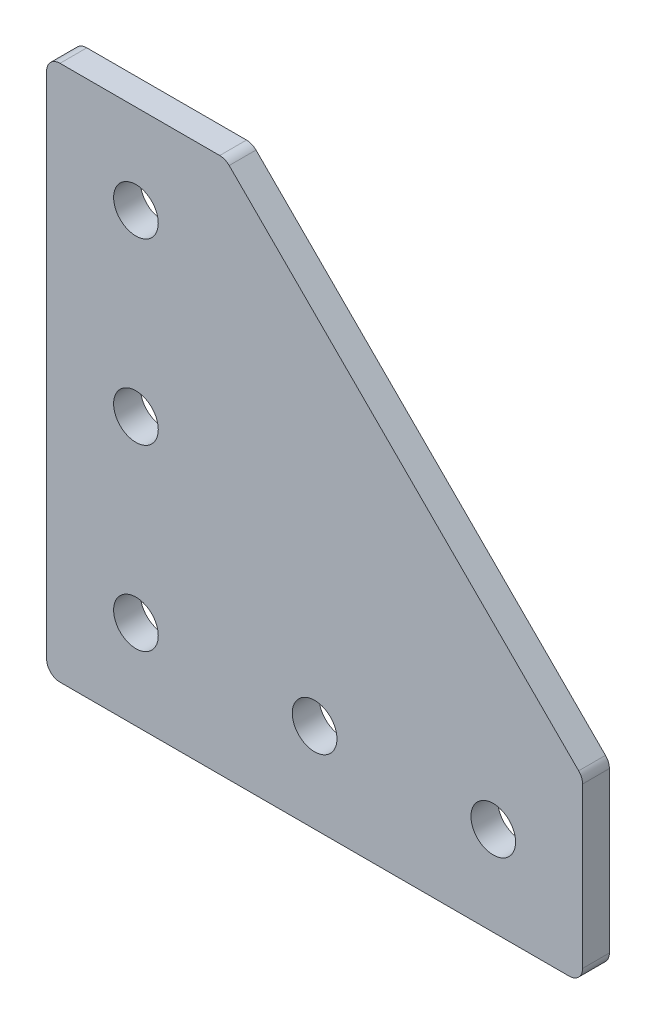
ISO-10303-21;
HEADER;
FILE_DESCRIPTION(('STEP AP214'),'2;1');
FILE_NAME('part.step','',(''),(''),'','','');
FILE_SCHEMA(('AUTOMOTIVE_DESIGN { 1 0 10303 214 1 1 1 1 }'));
ENDSEC;
DATA;
#1=APPLICATION_CONTEXT('core data for automotive mechanical design processes');
#2=APPLICATION_PROTOCOL_DEFINITION('international standard','automotive_design',2000,#1);
#3=PRODUCT_CONTEXT('',#1,'mechanical');
#4=PRODUCT('Part','Part','',(#3));
#5=PRODUCT_RELATED_PRODUCT_CATEGORY('part','',(#4));
#6=PRODUCT_DEFINITION_FORMATION('','',#4);
#7=PRODUCT_DEFINITION_CONTEXT('part definition',#1,'design');
#8=PRODUCT_DEFINITION('design','',#6,#7);
#9=PRODUCT_DEFINITION_SHAPE('','',#8);
#10=(LENGTH_UNIT() NAMED_UNIT(*) SI_UNIT(.MILLI.,.METRE.));
#11=(NAMED_UNIT(*) PLANE_ANGLE_UNIT() SI_UNIT($,.RADIAN.));
#12=(NAMED_UNIT(*) SI_UNIT($,.STERADIAN.) SOLID_ANGLE_UNIT());
#13=UNCERTAINTY_MEASURE_WITH_UNIT(LENGTH_MEASURE(1.E-05),#10,'distance_accuracy_value','');
#14=(GEOMETRIC_REPRESENTATION_CONTEXT(3) GLOBAL_UNCERTAINTY_ASSIGNED_CONTEXT((#13)) GLOBAL_UNIT_ASSIGNED_CONTEXT((#10,
#11,#12)) REPRESENTATION_CONTEXT('',''));
#15=CARTESIAN_POINT('',(0.,0.,0.));
#16=DIRECTION('',(0.,0.,1.));
#17=DIRECTION('',(1.,0.,0.));
#18=AXIS2_PLACEMENT_3D('',#15,#16,#17);
#19=CARTESIAN_POINT('',(58.5,19.3786796564404,-3.));
#20=DIRECTION('',(0.,0.,1.));
#21=DIRECTION('',(1.,0.,0.));
#22=AXIS2_PLACEMENT_3D('',#19,#20,#21);
#23=CYLINDRICAL_SURFACE('',#22,1.5);
#24=CARTESIAN_POINT('',(58.5,19.3786796564404,0.));
#25=DIRECTION('',(0.,0.,1.));
#26=DIRECTION('',(1.,0.,0.));
#27=AXIS2_PLACEMENT_3D('',#24,#25,#26);
#28=CIRCLE('',#27,1.5);
#29=CARTESIAN_POINT('',(60.,19.3786796564404,0.));
#30=VERTEX_POINT('',#29);
#31=CARTESIAN_POINT('',(59.5606601717798,20.4393398282202,0.));
#32=VERTEX_POINT('',#31);
#33=EDGE_CURVE('E144',#30,#32,#28,.T.);
#34=ORIENTED_EDGE('',*,*,#33,.F.);
#35=DIRECTION('',(0.,0.,1.));
#36=VECTOR('',#35,1.);
#37=CARTESIAN_POINT('',(60.,19.3786796564404,-3.));
#38=LINE('',#37,#36);
#39=CARTESIAN_POINT('',(60.,19.3786796564404,-3.));
#40=VERTEX_POINT('',#39);
#41=EDGE_CURVE('E11',#40,#30,#38,.T.);
#42=ORIENTED_EDGE('',*,*,#41,.F.);
#43=CARTESIAN_POINT('',(58.5,19.3786796564404,-3.));
#44=DIRECTION('',(0.,0.,1.));
#45=DIRECTION('',(1.,0.,0.));
#46=AXIS2_PLACEMENT_3D('',#43,#44,#45);
#47=CIRCLE('',#46,1.5);
#48=CARTESIAN_POINT('',(59.5606601717798,20.4393398282202,-3.));
#49=VERTEX_POINT('',#48);
#50=EDGE_CURVE('E171',#40,#49,#47,.T.);
#51=ORIENTED_EDGE('',*,*,#50,.T.);
#52=DIRECTION('',(0.,0.,1.));
#53=VECTOR('',#52,1.);
#54=CARTESIAN_POINT('',(59.5606601717798,20.4393398282202,-3.));
#55=LINE('',#54,#53);
#56=EDGE_CURVE('E38',#49,#32,#55,.T.);
#57=ORIENTED_EDGE('',*,*,#56,.T.);
#58=EDGE_LOOP('',(#34,#42,#51,#57));
#59=FACE_BOUND('',#58,.T.);
#60=ADVANCED_FACE('F35',(#59),#23,.T.);
#61=CARTESIAN_POINT('',(60.,19.3786796564404,-3.));
#62=DIRECTION('',(1.,0.,0.));
#63=DIRECTION('',(0.,0.,-1.));
#64=AXIS2_PLACEMENT_3D('',#61,#62,#63);
#65=PLANE('',#64);
#66=DIRECTION('',(0.,1.,0.));
#67=VECTOR('',#66,1.);
#68=CARTESIAN_POINT('',(60.,19.3786796564404,0.));
#69=LINE('',#68,#67);
#70=CARTESIAN_POINT('',(60.,1.50000000000001,0.));
#71=VERTEX_POINT('',#70);
#72=EDGE_CURVE('E169',#71,#30,#69,.T.);
#73=ORIENTED_EDGE('',*,*,#72,.F.);
#74=DIRECTION('',(0.,0.,1.));
#75=VECTOR('',#74,1.);
#76=CARTESIAN_POINT('',(60.,1.50000000000001,-3.));
#77=LINE('',#76,#75);
#78=CARTESIAN_POINT('',(60.,1.50000000000001,-3.));
#79=VERTEX_POINT('',#78);
#80=EDGE_CURVE('E44',#79,#71,#77,.T.);
#81=ORIENTED_EDGE('',*,*,#80,.F.);
#82=DIRECTION('',(0.,1.,0.));
#83=VECTOR('',#82,1.);
#84=CARTESIAN_POINT('',(60.,19.3786796564404,-3.));
#85=LINE('',#84,#83);
#86=EDGE_CURVE('E134',#79,#40,#85,.T.);
#87=ORIENTED_EDGE('',*,*,#86,.T.);
#88=ORIENTED_EDGE('',*,*,#41,.T.);
#89=EDGE_LOOP('',(#73,#81,#87,#88));
#90=FACE_BOUND('',#89,.T.);
#91=ADVANCED_FACE('F187',(#90),#65,.T.);
#92=CARTESIAN_POINT('',(58.5,1.5,-3.));
#93=DIRECTION('',(0.,0.,1.));
#94=DIRECTION('',(1.,0.,0.));
#95=AXIS2_PLACEMENT_3D('',#92,#93,#94);
#96=CYLINDRICAL_SURFACE('',#95,1.5);
#97=CARTESIAN_POINT('',(58.5,1.5,0.));
#98=DIRECTION('',(0.,0.,1.));
#99=DIRECTION('',(1.,0.,0.));
#100=AXIS2_PLACEMENT_3D('',#97,#98,#99);
#101=CIRCLE('',#100,1.5);
#102=CARTESIAN_POINT('',(58.5,0.,0.));
#103=VERTEX_POINT('',#102);
#104=EDGE_CURVE('E121',#103,#71,#101,.T.);
#105=ORIENTED_EDGE('',*,*,#104,.F.);
#106=DIRECTION('',(0.,0.,1.));
#107=VECTOR('',#106,1.);
#108=CARTESIAN_POINT('',(58.5,0.,-3.));
#109=LINE('',#108,#107);
#110=CARTESIAN_POINT('',(58.5,0.,-3.));
#111=VERTEX_POINT('',#110);
#112=EDGE_CURVE('E116',#111,#103,#109,.T.);
#113=ORIENTED_EDGE('',*,*,#112,.F.);
#114=CARTESIAN_POINT('',(58.5,1.5,-3.));
#115=DIRECTION('',(0.,0.,1.));
#116=DIRECTION('',(1.,0.,0.));
#117=AXIS2_PLACEMENT_3D('',#114,#115,#116);
#118=CIRCLE('',#117,1.5);
#119=EDGE_CURVE('E119',#111,#79,#118,.T.);
#120=ORIENTED_EDGE('',*,*,#119,.T.);
#121=ORIENTED_EDGE('',*,*,#80,.T.);
#122=EDGE_LOOP('',(#105,#113,#120,#121));
#123=FACE_BOUND('',#122,.T.);
#124=ADVANCED_FACE('F118',(#123),#96,.T.);
#125=CARTESIAN_POINT('',(1.50000000000001,0.,-3.));
#126=DIRECTION('',(0.,-1.,0.));
#127=DIRECTION('',(0.,0.,-1.));
#128=AXIS2_PLACEMENT_3D('',#125,#126,#127);
#129=PLANE('',#128);
#130=DIRECTION('',(1.,0.,0.));
#131=VECTOR('',#130,1.);
#132=CARTESIAN_POINT('',(1.50000000000001,0.,0.));
#133=LINE('',#132,#131);
#134=CARTESIAN_POINT('',(1.50000000000001,0.,0.));
#135=VERTEX_POINT('',#134);
#136=EDGE_CURVE('E166',#135,#103,#133,.T.);
#137=ORIENTED_EDGE('',*,*,#136,.F.);
#138=DIRECTION('',(0.,0.,1.));
#139=VECTOR('',#138,1.);
#140=CARTESIAN_POINT('',(1.50000000000001,0.,-3.));
#141=LINE('',#140,#139);
#142=CARTESIAN_POINT('',(1.50000000000001,0.,-3.));
#143=VERTEX_POINT('',#142);
#144=EDGE_CURVE('E126',#143,#135,#141,.T.);
#145=ORIENTED_EDGE('',*,*,#144,.F.);
#146=DIRECTION('',(1.,0.,0.));
#147=VECTOR('',#146,1.);
#148=CARTESIAN_POINT('',(1.50000000000001,0.,-3.));
#149=LINE('',#148,#147);
#150=EDGE_CURVE('E132',#143,#111,#149,.T.);
#151=ORIENTED_EDGE('',*,*,#150,.T.);
#152=ORIENTED_EDGE('',*,*,#112,.T.);
#153=EDGE_LOOP('',(#137,#145,#151,#152));
#154=FACE_BOUND('',#153,.T.);
#155=ADVANCED_FACE('F136',(#154),#129,.T.);
#156=CARTESIAN_POINT('',(1.5,1.5,-3.));
#157=DIRECTION('',(0.,0.,1.));
#158=DIRECTION('',(1.,0.,0.));
#159=AXIS2_PLACEMENT_3D('',#156,#157,#158);
#160=CYLINDRICAL_SURFACE('',#159,1.5);
#161=CARTESIAN_POINT('',(1.5,1.5,0.));
#162=DIRECTION('',(0.,0.,1.));
#163=DIRECTION('',(1.,0.,0.));
#164=AXIS2_PLACEMENT_3D('',#161,#162,#163);
#165=CIRCLE('',#164,1.5);
#166=CARTESIAN_POINT('',(0.,1.50000000000001,0.));
#167=VERTEX_POINT('',#166);
#168=EDGE_CURVE('E163',#167,#135,#165,.T.);
#169=ORIENTED_EDGE('',*,*,#168,.F.);
#170=DIRECTION('',(0.,0.,1.));
#171=VECTOR('',#170,1.);
#172=CARTESIAN_POINT('',(0.,1.50000000000001,-3.));
#173=LINE('',#172,#171);
#174=CARTESIAN_POINT('',(0.,1.50000000000001,-3.));
#175=VERTEX_POINT('',#174);
#176=EDGE_CURVE('E175',#175,#167,#173,.T.);
#177=ORIENTED_EDGE('',*,*,#176,.F.);
#178=CARTESIAN_POINT('',(1.5,1.5,-3.));
#179=DIRECTION('',(0.,0.,1.));
#180=DIRECTION('',(1.,0.,0.));
#181=AXIS2_PLACEMENT_3D('',#178,#179,#180);
#182=CIRCLE('',#181,1.5);
#183=EDGE_CURVE('E137',#175,#143,#182,.T.);
#184=ORIENTED_EDGE('',*,*,#183,.T.);
#185=ORIENTED_EDGE('',*,*,#144,.T.);
#186=EDGE_LOOP('',(#169,#177,#184,#185));
#187=FACE_BOUND('',#186,.T.);
#188=ADVANCED_FACE('F200',(#187),#160,.T.);
#189=CARTESIAN_POINT('',(0.,1.50000000000001,-3.));
#190=DIRECTION('',(-1.,0.,0.));
#191=DIRECTION('',(0.,0.,1.));
#192=AXIS2_PLACEMENT_3D('',#189,#190,#191);
#193=PLANE('',#192);
#194=DIRECTION('',(0.,-1.,0.));
#195=VECTOR('',#194,1.);
#196=CARTESIAN_POINT('',(0.,1.50000000000001,0.));
#197=LINE('',#196,#195);
#198=CARTESIAN_POINT('',(0.,58.5,0.));
#199=VERTEX_POINT('',#198);
#200=EDGE_CURVE('E160',#199,#167,#197,.T.);
#201=ORIENTED_EDGE('',*,*,#200,.F.);
#202=DIRECTION('',(0.,0.,1.));
#203=VECTOR('',#202,1.);
#204=CARTESIAN_POINT('',(0.,58.5,-3.));
#205=LINE('',#204,#203);
#206=CARTESIAN_POINT('',(0.,58.5,-3.));
#207=VERTEX_POINT('',#206);
#208=EDGE_CURVE('E177',#207,#199,#205,.T.);
#209=ORIENTED_EDGE('',*,*,#208,.F.);
#210=DIRECTION('',(0.,-1.,0.));
#211=VECTOR('',#210,1.);
#212=CARTESIAN_POINT('',(0.,1.50000000000001,-3.));
#213=LINE('',#212,#211);
#214=EDGE_CURVE('E139',#207,#175,#213,.T.);
#215=ORIENTED_EDGE('',*,*,#214,.T.);
#216=ORIENTED_EDGE('',*,*,#176,.T.);
#217=EDGE_LOOP('',(#201,#209,#215,#216));
#218=FACE_BOUND('',#217,.T.);
#219=ADVANCED_FACE('F203',(#218),#193,.T.);
#220=CARTESIAN_POINT('',(1.5,58.5,-3.));
#221=DIRECTION('',(0.,0.,1.));
#222=DIRECTION('',(1.,0.,0.));
#223=AXIS2_PLACEMENT_3D('',#220,#221,#222);
#224=CYLINDRICAL_SURFACE('',#223,1.5);
#225=CARTESIAN_POINT('',(1.5,58.5,0.));
#226=DIRECTION('',(0.,0.,1.));
#227=DIRECTION('',(1.,0.,0.));
#228=AXIS2_PLACEMENT_3D('',#225,#226,#227);
#229=CIRCLE('',#228,1.5);
#230=CARTESIAN_POINT('',(1.50000000000001,60.,0.));
#231=VERTEX_POINT('',#230);
#232=EDGE_CURVE('E157',#231,#199,#229,.T.);
#233=ORIENTED_EDGE('',*,*,#232,.F.);
#234=DIRECTION('',(0.,0.,1.));
#235=VECTOR('',#234,1.);
#236=CARTESIAN_POINT('',(1.50000000000001,60.,-3.));
#237=LINE('',#236,#235);
#238=CARTESIAN_POINT('',(1.50000000000001,60.,-3.));
#239=VERTEX_POINT('',#238);
#240=EDGE_CURVE('E179',#239,#231,#237,.T.);
#241=ORIENTED_EDGE('',*,*,#240,.F.);
#242=CARTESIAN_POINT('',(1.5,58.5,-3.));
#243=DIRECTION('',(0.,0.,1.));
#244=DIRECTION('',(1.,0.,0.));
#245=AXIS2_PLACEMENT_3D('',#242,#243,#244);
#246=CIRCLE('',#245,1.5);
#247=EDGE_CURVE('E293',#239,#207,#246,.T.);
#248=ORIENTED_EDGE('',*,*,#247,.T.);
#249=ORIENTED_EDGE('',*,*,#208,.T.);
#250=EDGE_LOOP('',(#233,#241,#248,#249));
#251=FACE_BOUND('',#250,.T.);
#252=ADVANCED_FACE('F207',(#251),#224,.T.);
#253=CARTESIAN_POINT('',(1.50000000000001,60.,-3.));
#254=DIRECTION('',(0.,1.,0.));
#255=DIRECTION('',(0.,0.,1.));
#256=AXIS2_PLACEMENT_3D('',#253,#254,#255);
#257=PLANE('',#256);
#258=DIRECTION('',(-1.,0.,0.));
#259=VECTOR('',#258,1.);
#260=CARTESIAN_POINT('',(1.50000000000001,60.,0.));
#261=LINE('',#260,#259);
#262=CARTESIAN_POINT('',(19.3786796564404,60.,0.));
#263=VERTEX_POINT('',#262);
#264=EDGE_CURVE('E154',#263,#231,#261,.T.);
#265=ORIENTED_EDGE('',*,*,#264,.F.);
#266=DIRECTION('',(0.,0.,1.));
#267=VECTOR('',#266,1.);
#268=CARTESIAN_POINT('',(19.3786796564404,60.,-3.));
#269=LINE('',#268,#267);
#270=CARTESIAN_POINT('',(19.3786796564404,60.,-3.));
#271=VERTEX_POINT('',#270);
#272=EDGE_CURVE('E181',#271,#263,#269,.T.);
#273=ORIENTED_EDGE('',*,*,#272,.F.);
#274=DIRECTION('',(-1.,0.,0.));
#275=VECTOR('',#274,1.);
#276=CARTESIAN_POINT('',(1.50000000000001,60.,-3.));
#277=LINE('',#276,#275);
#278=EDGE_CURVE('E290',#271,#239,#277,.T.);
#279=ORIENTED_EDGE('',*,*,#278,.T.);
#280=ORIENTED_EDGE('',*,*,#240,.T.);
#281=EDGE_LOOP('',(#265,#273,#279,#280));
#282=FACE_BOUND('',#281,.T.);
#283=ADVANCED_FACE('F211',(#282),#257,.T.);
#284=CARTESIAN_POINT('',(19.3786796564404,58.5,-3.));
#285=DIRECTION('',(0.,0.,1.));
#286=DIRECTION('',(1.,0.,0.));
#287=AXIS2_PLACEMENT_3D('',#284,#285,#286);
#288=CYLINDRICAL_SURFACE('',#287,1.5);
#289=CARTESIAN_POINT('',(19.3786796564404,58.5,0.));
#290=DIRECTION('',(0.,0.,1.));
#291=DIRECTION('',(-1.,0.,0.));
#292=AXIS2_PLACEMENT_3D('',#289,#290,#291);
#293=CIRCLE('',#292,1.5);
#294=CARTESIAN_POINT('',(20.4393398282202,59.5606601717798,0.));
#295=VERTEX_POINT('',#294);
#296=EDGE_CURVE('E151',#295,#263,#293,.T.);
#297=ORIENTED_EDGE('',*,*,#296,.F.);
#298=DIRECTION('',(0.,0.,1.));
#299=VECTOR('',#298,1.);
#300=CARTESIAN_POINT('',(20.4393398282202,59.5606601717798,-3.));
#301=LINE('',#300,#299);
#302=CARTESIAN_POINT('',(20.4393398282202,59.5606601717798,-3.));
#303=VERTEX_POINT('',#302);
#304=EDGE_CURVE('E182',#303,#295,#301,.T.);
#305=ORIENTED_EDGE('',*,*,#304,.F.);
#306=CARTESIAN_POINT('',(19.3786796564404,58.5,-3.));
#307=DIRECTION('',(0.,0.,1.));
#308=DIRECTION('',(-1.,0.,0.));
#309=AXIS2_PLACEMENT_3D('',#306,#307,#308);
#310=CIRCLE('',#309,1.5);
#311=EDGE_CURVE('E287',#303,#271,#310,.T.);
#312=ORIENTED_EDGE('',*,*,#311,.T.);
#313=ORIENTED_EDGE('',*,*,#272,.T.);
#314=EDGE_LOOP('',(#297,#305,#312,#313));
#315=FACE_BOUND('',#314,.T.);
#316=ADVANCED_FACE('F215',(#315),#288,.T.);
#317=CARTESIAN_POINT('',(20.4393398282202,59.5606601717798,-3.));
#318=DIRECTION('',(0.707106781186547,0.707106781186547,0.));
#319=DIRECTION('',(-0.707106781186548,0.707106781186548,0.));
#320=AXIS2_PLACEMENT_3D('',#317,#318,#319);
#321=PLANE('',#320);
#322=DIRECTION('',(-0.707106781186548,0.707106781186548,0.));
#323=VECTOR('',#322,1.);
#324=CARTESIAN_POINT('',(20.4393398282202,59.5606601717798,0.));
#325=LINE('',#324,#323);
#326=EDGE_CURVE('E147',#32,#295,#325,.T.);
#327=ORIENTED_EDGE('',*,*,#326,.F.);
#328=ORIENTED_EDGE('',*,*,#56,.F.);
#329=DIRECTION('',(-0.707106781186548,0.707106781186548,0.));
#330=VECTOR('',#329,1.);
#331=CARTESIAN_POINT('',(20.4393398282202,59.5606601717798,-3.));
#332=LINE('',#331,#330);
#333=EDGE_CURVE('E285',#49,#303,#332,.T.);
#334=ORIENTED_EDGE('',*,*,#333,.T.);
#335=ORIENTED_EDGE('',*,*,#304,.T.);
#336=EDGE_LOOP('',(#327,#328,#334,#335));
#337=FACE_BOUND('',#336,.T.);
#338=ADVANCED_FACE('F184',(#337),#321,.T.);
#339=CARTESIAN_POINT('',(58.5,19.3786796564404,-3.));
#340=DIRECTION('',(0.,0.,1.));
#341=DIRECTION('',(1.,0.,0.));
#342=AXIS2_PLACEMENT_3D('',#339,#340,#341);
#343=PLANE('',#342);
#344=CARTESIAN_POINT('',(9.99999999999986,50.,-3.));
#345=DIRECTION('',(0.,0.,1.));
#346=DIRECTION('',(1.,0.,0.));
#347=AXIS2_PLACEMENT_3D('',#344,#345,#346);
#348=CIRCLE('',#347,2.5);
#349=CARTESIAN_POINT('',(12.4999999999999,50.,-3.));
#350=VERTEX_POINT('',#349);
#351=EDGE_CURVE('E254',#350,#350,#348,.T.);
#352=ORIENTED_EDGE('',*,*,#351,.T.);
#353=EDGE_LOOP('',(#352));
#354=FACE_BOUND('',#353,.T.);
#355=CARTESIAN_POINT('',(10.,30.,-3.));
#356=DIRECTION('',(0.,0.,1.));
#357=DIRECTION('',(1.,0.,0.));
#358=AXIS2_PLACEMENT_3D('',#355,#356,#357);
#359=CIRCLE('',#358,2.49999999999992);
#360=CARTESIAN_POINT('',(12.4999999999999,30.,-3.));
#361=VERTEX_POINT('',#360);
#362=EDGE_CURVE('E262',#361,#361,#359,.T.);
#363=ORIENTED_EDGE('',*,*,#362,.T.);
#364=EDGE_LOOP('',(#363));
#365=FACE_BOUND('',#364,.T.);
#366=CARTESIAN_POINT('',(50.,10.,-3.));
#367=DIRECTION('',(0.,0.,1.));
#368=DIRECTION('',(1.,0.,0.));
#369=AXIS2_PLACEMENT_3D('',#366,#367,#368);
#370=CIRCLE('',#369,2.5);
#371=CARTESIAN_POINT('',(52.5,10.,-3.));
#372=VERTEX_POINT('',#371);
#373=EDGE_CURVE('E268',#372,#372,#370,.T.);
#374=ORIENTED_EDGE('',*,*,#373,.T.);
#375=EDGE_LOOP('',(#374));
#376=FACE_BOUND('',#375,.T.);
#377=CARTESIAN_POINT('',(30.,10.,-3.));
#378=DIRECTION('',(0.,0.,1.));
#379=DIRECTION('',(1.,0.,0.));
#380=AXIS2_PLACEMENT_3D('',#377,#378,#379);
#381=CIRCLE('',#380,2.5);
#382=CARTESIAN_POINT('',(32.5,10.,-3.));
#383=VERTEX_POINT('',#382);
#384=EDGE_CURVE('E274',#383,#383,#381,.T.);
#385=ORIENTED_EDGE('',*,*,#384,.T.);
#386=EDGE_LOOP('',(#385));
#387=FACE_BOUND('',#386,.T.);
#388=CARTESIAN_POINT('',(10.,10.,-3.));
#389=DIRECTION('',(0.,0.,1.));
#390=DIRECTION('',(1.,0.,0.));
#391=AXIS2_PLACEMENT_3D('',#388,#389,#390);
#392=CIRCLE('',#391,2.5);
#393=CARTESIAN_POINT('',(12.5,10.,-3.));
#394=VERTEX_POINT('',#393);
#395=EDGE_CURVE('E148',#394,#394,#392,.T.);
#396=ORIENTED_EDGE('',*,*,#395,.T.);
#397=EDGE_LOOP('',(#396));
#398=FACE_BOUND('',#397,.T.);
#399=ORIENTED_EDGE('',*,*,#50,.F.);
#400=ORIENTED_EDGE('',*,*,#86,.F.);
#401=ORIENTED_EDGE('',*,*,#119,.F.);
#402=ORIENTED_EDGE('',*,*,#150,.F.);
#403=ORIENTED_EDGE('',*,*,#183,.F.);
#404=ORIENTED_EDGE('',*,*,#214,.F.);
#405=ORIENTED_EDGE('',*,*,#247,.F.);
#406=ORIENTED_EDGE('',*,*,#278,.F.);
#407=ORIENTED_EDGE('',*,*,#311,.F.);
#408=ORIENTED_EDGE('',*,*,#333,.F.);
#409=EDGE_LOOP('',(#399,#400,#401,#402,#403,#404,#405,#406,#407,#408));
#410=FACE_BOUND('',#409,.T.);
#411=ADVANCED_FACE('F130',(#354,#365,#376,#387,#398,#410),#343,.F.);
#412=CARTESIAN_POINT('',(58.5,19.3786796564404,0.));
#413=DIRECTION('',(0.,0.,1.));
#414=DIRECTION('',(1.,0.,0.));
#415=AXIS2_PLACEMENT_3D('',#412,#413,#414);
#416=PLANE('',#415);
#417=CARTESIAN_POINT('',(9.99999999999986,50.,0.));
#418=DIRECTION('',(0.,0.,1.));
#419=DIRECTION('',(1.,0.,0.));
#420=AXIS2_PLACEMENT_3D('',#417,#418,#419);
#421=CIRCLE('',#420,2.5);
#422=CARTESIAN_POINT('',(12.4999999999999,50.,0.));
#423=VERTEX_POINT('',#422);
#424=EDGE_CURVE('E257',#423,#423,#421,.T.);
#425=ORIENTED_EDGE('',*,*,#424,.F.);
#426=EDGE_LOOP('',(#425));
#427=FACE_BOUND('',#426,.T.);
#428=CARTESIAN_POINT('',(10.,30.,0.));
#429=DIRECTION('',(0.,0.,1.));
#430=DIRECTION('',(1.,0.,0.));
#431=AXIS2_PLACEMENT_3D('',#428,#429,#430);
#432=CIRCLE('',#431,2.49999999999992);
#433=CARTESIAN_POINT('',(12.4999999999999,30.,0.));
#434=VERTEX_POINT('',#433);
#435=EDGE_CURVE('E259',#434,#434,#432,.T.);
#436=ORIENTED_EDGE('',*,*,#435,.F.);
#437=EDGE_LOOP('',(#436));
#438=FACE_BOUND('',#437,.T.);
#439=CARTESIAN_POINT('',(50.,10.,0.));
#440=DIRECTION('',(0.,0.,1.));
#441=DIRECTION('',(1.,0.,0.));
#442=AXIS2_PLACEMENT_3D('',#439,#440,#441);
#443=CIRCLE('',#442,2.5);
#444=CARTESIAN_POINT('',(52.5,10.,0.));
#445=VERTEX_POINT('',#444);
#446=EDGE_CURVE('E265',#445,#445,#443,.T.);
#447=ORIENTED_EDGE('',*,*,#446,.F.);
#448=EDGE_LOOP('',(#447));
#449=FACE_BOUND('',#448,.T.);
#450=CARTESIAN_POINT('',(30.,10.,0.));
#451=DIRECTION('',(0.,0.,1.));
#452=DIRECTION('',(1.,0.,0.));
#453=AXIS2_PLACEMENT_3D('',#450,#451,#452);
#454=CIRCLE('',#453,2.5);
#455=CARTESIAN_POINT('',(32.5,10.,0.));
#456=VERTEX_POINT('',#455);
#457=EDGE_CURVE('E271',#456,#456,#454,.T.);
#458=ORIENTED_EDGE('',*,*,#457,.F.);
#459=EDGE_LOOP('',(#458));
#460=FACE_BOUND('',#459,.T.);
#461=CARTESIAN_POINT('',(10.,10.,0.));
#462=DIRECTION('',(0.,0.,1.));
#463=DIRECTION('',(1.,0.,0.));
#464=AXIS2_PLACEMENT_3D('',#461,#462,#463);
#465=CIRCLE('',#464,2.5);
#466=CARTESIAN_POINT('',(12.5,10.,0.));
#467=VERTEX_POINT('',#466);
#468=EDGE_CURVE('E277',#467,#467,#465,.T.);
#469=ORIENTED_EDGE('',*,*,#468,.F.);
#470=EDGE_LOOP('',(#469));
#471=FACE_BOUND('',#470,.T.);
#472=ORIENTED_EDGE('',*,*,#33,.T.);
#473=ORIENTED_EDGE('',*,*,#326,.T.);
#474=ORIENTED_EDGE('',*,*,#296,.T.);
#475=ORIENTED_EDGE('',*,*,#264,.T.);
#476=ORIENTED_EDGE('',*,*,#232,.T.);
#477=ORIENTED_EDGE('',*,*,#200,.T.);
#478=ORIENTED_EDGE('',*,*,#168,.T.);
#479=ORIENTED_EDGE('',*,*,#136,.T.);
#480=ORIENTED_EDGE('',*,*,#104,.T.);
#481=ORIENTED_EDGE('',*,*,#72,.T.);
#482=EDGE_LOOP('',(#472,#473,#474,#475,#476,#477,#478,#479,#480,#481));
#483=FACE_BOUND('',#482,.T.);
#484=ADVANCED_FACE('F186',(#427,#438,#449,#460,#471,#483),#416,.T.);
#485=CARTESIAN_POINT('',(10.,10.,-3.));
#486=DIRECTION('',(0.,0.,1.));
#487=DIRECTION('',(1.,0.,0.));
#488=AXIS2_PLACEMENT_3D('',#485,#486,#487);
#489=CYLINDRICAL_SURFACE('',#488,2.5);
#490=ORIENTED_EDGE('',*,*,#395,.F.);
#491=EDGE_LOOP('',(#490));
#492=FACE_BOUND('',#491,.T.);
#493=ORIENTED_EDGE('',*,*,#468,.T.);
#494=EDGE_LOOP('',(#493));
#495=FACE_BOUND('',#494,.T.);
#496=ADVANCED_FACE('F227',(#492,#495),#489,.F.);
#497=CARTESIAN_POINT('',(30.,10.,-3.));
#498=DIRECTION('',(0.,0.,1.));
#499=DIRECTION('',(1.,0.,0.));
#500=AXIS2_PLACEMENT_3D('',#497,#498,#499);
#501=CYLINDRICAL_SURFACE('',#500,2.5);
#502=ORIENTED_EDGE('',*,*,#384,.F.);
#503=EDGE_LOOP('',(#502));
#504=FACE_BOUND('',#503,.T.);
#505=ORIENTED_EDGE('',*,*,#457,.T.);
#506=EDGE_LOOP('',(#505));
#507=FACE_BOUND('',#506,.T.);
#508=ADVANCED_FACE('F234',(#504,#507),#501,.F.);
#509=CARTESIAN_POINT('',(50.,10.,-3.));
#510=DIRECTION('',(0.,0.,1.));
#511=DIRECTION('',(1.,0.,0.));
#512=AXIS2_PLACEMENT_3D('',#509,#510,#511);
#513=CYLINDRICAL_SURFACE('',#512,2.5);
#514=ORIENTED_EDGE('',*,*,#373,.F.);
#515=EDGE_LOOP('',(#514));
#516=FACE_BOUND('',#515,.T.);
#517=ORIENTED_EDGE('',*,*,#446,.T.);
#518=EDGE_LOOP('',(#517));
#519=FACE_BOUND('',#518,.T.);
#520=ADVANCED_FACE('F238',(#516,#519),#513,.F.);
#521=CARTESIAN_POINT('',(10.,30.,-3.));
#522=DIRECTION('',(0.,0.,1.));
#523=DIRECTION('',(1.,0.,0.));
#524=AXIS2_PLACEMENT_3D('',#521,#522,#523);
#525=CYLINDRICAL_SURFACE('',#524,2.49999999999992);
#526=ORIENTED_EDGE('',*,*,#362,.F.);
#527=EDGE_LOOP('',(#526));
#528=FACE_BOUND('',#527,.T.);
#529=ORIENTED_EDGE('',*,*,#435,.T.);
#530=EDGE_LOOP('',(#529));
#531=FACE_BOUND('',#530,.T.);
#532=ADVANCED_FACE('F242',(#528,#531),#525,.F.);
#533=CARTESIAN_POINT('',(9.99999999999986,50.,-3.));
#534=DIRECTION('',(0.,0.,1.));
#535=DIRECTION('',(1.,0.,0.));
#536=AXIS2_PLACEMENT_3D('',#533,#534,#535);
#537=CYLINDRICAL_SURFACE('',#536,2.5);
#538=ORIENTED_EDGE('',*,*,#351,.F.);
#539=EDGE_LOOP('',(#538));
#540=FACE_BOUND('',#539,.T.);
#541=ORIENTED_EDGE('',*,*,#424,.T.);
#542=EDGE_LOOP('',(#541));
#543=FACE_BOUND('',#542,.T.);
#544=ADVANCED_FACE('F246',(#540,#543),#537,.F.);
#545=CLOSED_SHELL('',(#60,#91,#124,#155,#188,#219,#252,#283,#316,#338,#411,#484,#496,#508,#520,
#532,#544));
#546=MANIFOLD_SOLID_BREP('B2',#545);
#547=ADVANCED_BREP_SHAPE_REPRESENTATION('',(#18,#546),#14);
#548=SHAPE_DEFINITION_REPRESENTATION(#9,#547);
ENDSEC;
END-ISO-10303-21;
